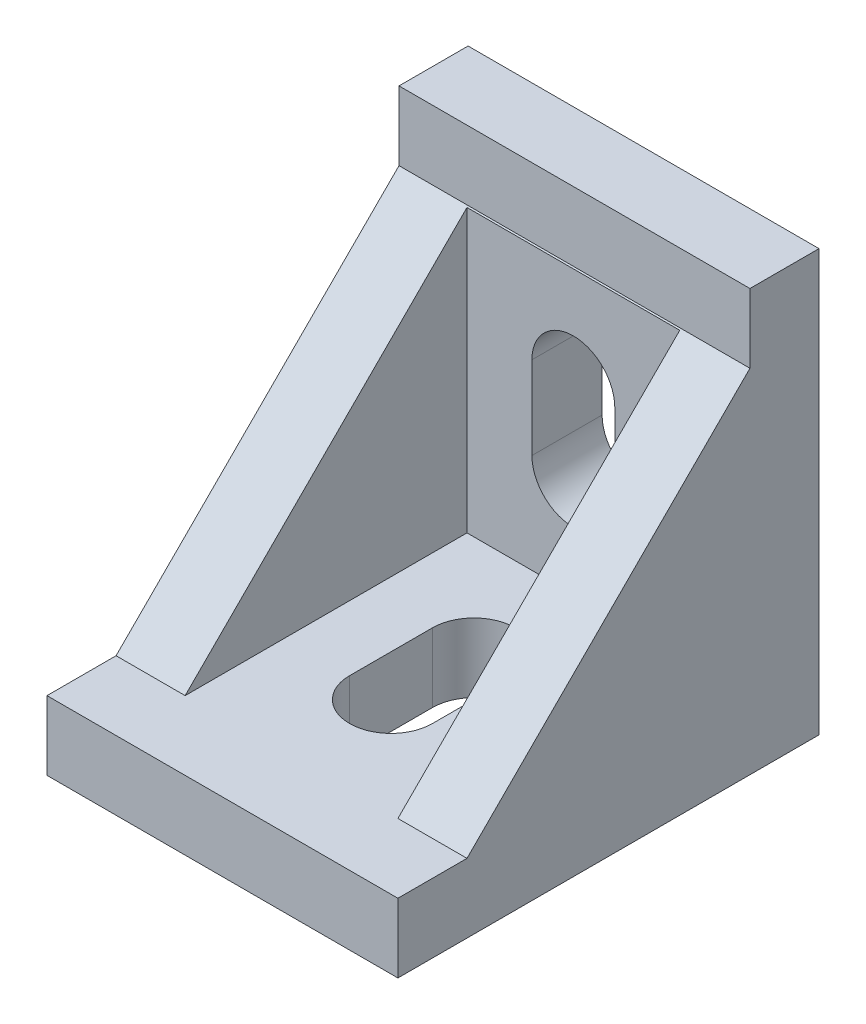
ISO-10303-21;
HEADER;
FILE_DESCRIPTION(('STEP AP214'),'2;1');
FILE_NAME('part.step','',(''),(''),'','','');
FILE_SCHEMA(('AUTOMOTIVE_DESIGN { 1 0 10303 214 1 1 1 1 }'));
ENDSEC;
DATA;
#1=APPLICATION_CONTEXT('core data for automotive mechanical design processes');
#2=APPLICATION_PROTOCOL_DEFINITION('international standard','automotive_design',2000,#1);
#3=PRODUCT_CONTEXT('',#1,'mechanical');
#4=PRODUCT('Part','Part','',(#3));
#5=PRODUCT_RELATED_PRODUCT_CATEGORY('part','',(#4));
#6=PRODUCT_DEFINITION_FORMATION('','',#4);
#7=PRODUCT_DEFINITION_CONTEXT('part definition',#1,'design');
#8=PRODUCT_DEFINITION('design','',#6,#7);
#9=PRODUCT_DEFINITION_SHAPE('','',#8);
#10=(LENGTH_UNIT() NAMED_UNIT(*) SI_UNIT(.MILLI.,.METRE.));
#11=(NAMED_UNIT(*) PLANE_ANGLE_UNIT() SI_UNIT($,.RADIAN.));
#12=(NAMED_UNIT(*) SI_UNIT($,.STERADIAN.) SOLID_ANGLE_UNIT());
#13=UNCERTAINTY_MEASURE_WITH_UNIT(LENGTH_MEASURE(1.E-05),#10,'distance_accuracy_value','');
#14=(GEOMETRIC_REPRESENTATION_CONTEXT(3) GLOBAL_UNCERTAINTY_ASSIGNED_CONTEXT((#13)) GLOBAL_UNIT_ASSIGNED_CONTEXT((#10,
#11,#12)) REPRESENTATION_CONTEXT('',''));
#15=CARTESIAN_POINT('',(0.,0.,0.));
#16=DIRECTION('',(0.,0.,1.));
#17=DIRECTION('',(1.,0.,0.));
#18=AXIS2_PLACEMENT_3D('',#15,#16,#17);
#19=CARTESIAN_POINT('',(25.4,5.,0.));
#20=DIRECTION('',(0.,0.,-1.));
#21=DIRECTION('',(0.,1.,0.));
#22=AXIS2_PLACEMENT_3D('',#19,#20,#21);
#23=PLANE('',#22);
#24=DIRECTION('',(0.,-1.,0.));
#25=VECTOR('',#24,1.);
#26=CARTESIAN_POINT('',(0.,5.,0.));
#27=LINE('',#26,#25);
#28=CARTESIAN_POINT('',(0.,5.,0.));
#29=VERTEX_POINT('',#28);
#30=CARTESIAN_POINT('',(0.,0.,0.));
#31=VERTEX_POINT('',#30);
#32=EDGE_CURVE('E231',#29,#31,#27,.T.);
#33=ORIENTED_EDGE('',*,*,#32,.T.);
#34=DIRECTION('',(-1.,0.,0.));
#35=VECTOR('',#34,1.);
#36=CARTESIAN_POINT('',(25.4,0.,0.));
#37=LINE('',#36,#35);
#38=CARTESIAN_POINT('',(25.4,0.,0.));
#39=VERTEX_POINT('',#38);
#40=EDGE_CURVE('E281',#39,#31,#37,.T.);
#41=ORIENTED_EDGE('',*,*,#40,.F.);
#42=DIRECTION('',(0.,-1.,0.));
#43=VECTOR('',#42,1.);
#44=CARTESIAN_POINT('',(25.4,5.,0.));
#45=LINE('',#44,#43);
#46=CARTESIAN_POINT('',(25.4,5.,0.));
#47=VERTEX_POINT('',#46);
#48=EDGE_CURVE('E232',#47,#39,#45,.T.);
#49=ORIENTED_EDGE('',*,*,#48,.F.);
#50=DIRECTION('',(-1.,0.,0.));
#51=VECTOR('',#50,1.);
#52=CARTESIAN_POINT('',(25.4,5.,0.));
#53=LINE('',#52,#51);
#54=EDGE_CURVE('E248',#47,#29,#53,.T.);
#55=ORIENTED_EDGE('',*,*,#54,.T.);
#56=EDGE_LOOP('',(#33,#41,#49,#55));
#57=FACE_BOUND('',#56,.T.);
#58=ADVANCED_FACE('F39',(#57),#23,.F.);
#59=CARTESIAN_POINT('',(25.4,0.,0.));
#60=DIRECTION('',(0.,1.,0.));
#61=DIRECTION('',(0.,0.,1.));
#62=AXIS2_PLACEMENT_3D('',#59,#60,#61);
#63=PLANE('',#62);
#64=DIRECTION('',(0.,0.,-1.));
#65=VECTOR('',#64,1.);
#66=CARTESIAN_POINT('',(15.7,0.,-18.2));
#67=LINE('',#66,#65);
#68=CARTESIAN_POINT('',(15.7,0.,-12.2));
#69=VERTEX_POINT('',#68);
#70=CARTESIAN_POINT('',(15.7,0.,-18.2));
#71=VERTEX_POINT('',#70);
#72=EDGE_CURVE('E170',#69,#71,#67,.T.);
#73=ORIENTED_EDGE('',*,*,#72,.T.);
#74=CARTESIAN_POINT('',(12.7,0.,-18.2));
#75=DIRECTION('',(0.,1.,0.));
#76=DIRECTION('',(0.,0.,1.));
#77=AXIS2_PLACEMENT_3D('',#74,#75,#76);
#78=CIRCLE('',#77,2.99999999999999);
#79=CARTESIAN_POINT('',(9.70000000000001,0.,-18.2));
#80=VERTEX_POINT('',#79);
#81=EDGE_CURVE('E166',#71,#80,#78,.T.);
#82=ORIENTED_EDGE('',*,*,#81,.T.);
#83=DIRECTION('',(0.,0.,1.));
#84=VECTOR('',#83,1.);
#85=CARTESIAN_POINT('',(9.70000000000001,0.,-18.2));
#86=LINE('',#85,#84);
#87=CARTESIAN_POINT('',(9.70000000000001,0.,-12.2));
#88=VERTEX_POINT('',#87);
#89=EDGE_CURVE('E173',#80,#88,#86,.T.);
#90=ORIENTED_EDGE('',*,*,#89,.T.);
#91=CARTESIAN_POINT('',(12.7,0.,-12.2));
#92=DIRECTION('',(0.,1.,0.));
#93=DIRECTION('',(0.,0.,1.));
#94=AXIS2_PLACEMENT_3D('',#91,#92,#93);
#95=CIRCLE('',#94,2.99999999999999);
#96=EDGE_CURVE('E53',#88,#69,#95,.T.);
#97=ORIENTED_EDGE('',*,*,#96,.T.);
#98=EDGE_LOOP('',(#73,#82,#90,#97));
#99=FACE_BOUND('',#98,.T.);
#100=DIRECTION('',(0.,0.,-1.));
#101=VECTOR('',#100,1.);
#102=CARTESIAN_POINT('',(0.,0.,0.));
#103=LINE('',#102,#101);
#104=CARTESIAN_POINT('',(0.,0.,-30.48));
#105=VERTEX_POINT('',#104);
#106=EDGE_CURVE('E251',#31,#105,#103,.T.);
#107=ORIENTED_EDGE('',*,*,#106,.T.);
#108=DIRECTION('',(-1.,0.,0.));
#109=VECTOR('',#108,1.);
#110=CARTESIAN_POINT('',(25.4,0.,-30.48));
#111=LINE('',#110,#109);
#112=CARTESIAN_POINT('',(25.4,0.,-30.48));
#113=VERTEX_POINT('',#112);
#114=EDGE_CURVE('E278',#113,#105,#111,.T.);
#115=ORIENTED_EDGE('',*,*,#114,.F.);
#116=DIRECTION('',(0.,0.,-1.));
#117=VECTOR('',#116,1.);
#118=CARTESIAN_POINT('',(25.4,0.,0.));
#119=LINE('',#118,#117);
#120=EDGE_CURVE('E235',#39,#113,#119,.T.);
#121=ORIENTED_EDGE('',*,*,#120,.F.);
#122=ORIENTED_EDGE('',*,*,#40,.T.);
#123=EDGE_LOOP('',(#107,#115,#121,#122));
#124=FACE_BOUND('',#123,.T.);
#125=ADVANCED_FACE('F177',(#99,#124),#63,.F.);
#126=CARTESIAN_POINT('',(25.4,0.,-30.48));
#127=DIRECTION('',(0.,0.,1.));
#128=DIRECTION('',(1.,0.,0.));
#129=AXIS2_PLACEMENT_3D('',#126,#127,#128);
#130=PLANE('',#129);
#131=DIRECTION('',(0.,1.,0.));
#132=VECTOR('',#131,1.);
#133=CARTESIAN_POINT('',(15.7,18.2,-30.48));
#134=LINE('',#133,#132);
#135=CARTESIAN_POINT('',(15.7,12.2,-30.48));
#136=VERTEX_POINT('',#135);
#137=CARTESIAN_POINT('',(15.7,18.2,-30.48));
#138=VERTEX_POINT('',#137);
#139=EDGE_CURVE('E199',#136,#138,#134,.T.);
#140=ORIENTED_EDGE('',*,*,#139,.T.);
#141=CARTESIAN_POINT('',(12.7,18.2,-30.48));
#142=DIRECTION('',(0.,0.,1.));
#143=DIRECTION('',(1.,0.,0.));
#144=AXIS2_PLACEMENT_3D('',#141,#142,#143);
#145=CIRCLE('',#144,3.);
#146=CARTESIAN_POINT('',(9.7,18.2,-30.48));
#147=VERTEX_POINT('',#146);
#148=EDGE_CURVE('E186',#138,#147,#145,.T.);
#149=ORIENTED_EDGE('',*,*,#148,.T.);
#150=DIRECTION('',(0.,-1.,0.));
#151=VECTOR('',#150,1.);
#152=CARTESIAN_POINT('',(9.7,18.2,-30.48));
#153=LINE('',#152,#151);
#154=CARTESIAN_POINT('',(9.7,12.2,-30.48));
#155=VERTEX_POINT('',#154);
#156=EDGE_CURVE('E193',#147,#155,#153,.T.);
#157=ORIENTED_EDGE('',*,*,#156,.T.);
#158=CARTESIAN_POINT('',(12.7,12.2,-30.48));
#159=DIRECTION('',(0.,0.,1.));
#160=DIRECTION('',(1.,0.,0.));
#161=AXIS2_PLACEMENT_3D('',#158,#159,#160);
#162=CIRCLE('',#161,3.);
#163=EDGE_CURVE('E196',#155,#136,#162,.T.);
#164=ORIENTED_EDGE('',*,*,#163,.T.);
#165=EDGE_LOOP('',(#140,#149,#157,#164));
#166=FACE_BOUND('',#165,.T.);
#167=DIRECTION('',(0.,1.,0.));
#168=VECTOR('',#167,1.);
#169=CARTESIAN_POINT('',(0.,0.,-30.48));
#170=LINE('',#169,#168);
#171=CARTESIAN_POINT('',(0.,30.48,-30.48));
#172=VERTEX_POINT('',#171);
#173=EDGE_CURVE('E253',#105,#172,#170,.T.);
#174=ORIENTED_EDGE('',*,*,#173,.T.);
#175=DIRECTION('',(-1.,0.,0.));
#176=VECTOR('',#175,1.);
#177=CARTESIAN_POINT('',(25.4,30.48,-30.48));
#178=LINE('',#177,#176);
#179=CARTESIAN_POINT('',(25.4,30.48,-30.48));
#180=VERTEX_POINT('',#179);
#181=EDGE_CURVE('E275',#180,#172,#178,.T.);
#182=ORIENTED_EDGE('',*,*,#181,.F.);
#183=DIRECTION('',(0.,1.,0.));
#184=VECTOR('',#183,1.);
#185=CARTESIAN_POINT('',(25.4,0.,-30.48));
#186=LINE('',#185,#184);
#187=EDGE_CURVE('E238',#113,#180,#186,.T.);
#188=ORIENTED_EDGE('',*,*,#187,.F.);
#189=ORIENTED_EDGE('',*,*,#114,.T.);
#190=EDGE_LOOP('',(#174,#182,#188,#189));
#191=FACE_BOUND('',#190,.T.);
#192=ADVANCED_FACE('F321',(#166,#191),#130,.F.);
#193=CARTESIAN_POINT('',(25.4,30.48,-30.48));
#194=DIRECTION('',(0.,-1.,0.));
#195=DIRECTION('',(0.,0.,-1.));
#196=AXIS2_PLACEMENT_3D('',#193,#194,#195);
#197=PLANE('',#196);
#198=DIRECTION('',(0.,0.,1.));
#199=VECTOR('',#198,1.);
#200=CARTESIAN_POINT('',(0.,30.48,-30.48));
#201=LINE('',#200,#199);
#202=CARTESIAN_POINT('',(0.,30.48,-25.48));
#203=VERTEX_POINT('',#202);
#204=EDGE_CURVE('E255',#172,#203,#201,.T.);
#205=ORIENTED_EDGE('',*,*,#204,.T.);
#206=DIRECTION('',(-1.,0.,0.));
#207=VECTOR('',#206,1.);
#208=CARTESIAN_POINT('',(25.4,30.48,-25.48));
#209=LINE('',#208,#207);
#210=CARTESIAN_POINT('',(25.4,30.48,-25.48));
#211=VERTEX_POINT('',#210);
#212=EDGE_CURVE('E272',#211,#203,#209,.T.);
#213=ORIENTED_EDGE('',*,*,#212,.F.);
#214=DIRECTION('',(0.,0.,1.));
#215=VECTOR('',#214,1.);
#216=CARTESIAN_POINT('',(25.4,30.48,-30.48));
#217=LINE('',#216,#215);
#218=EDGE_CURVE('E240',#180,#211,#217,.T.);
#219=ORIENTED_EDGE('',*,*,#218,.F.);
#220=ORIENTED_EDGE('',*,*,#181,.T.);
#221=EDGE_LOOP('',(#205,#213,#219,#220));
#222=FACE_BOUND('',#221,.T.);
#223=ADVANCED_FACE('F352',(#222),#197,.F.);
#224=CARTESIAN_POINT('',(25.4,30.48,-25.48));
#225=DIRECTION('',(0.,0.,-1.));
#226=DIRECTION('',(-1.,0.,0.));
#227=AXIS2_PLACEMENT_3D('',#224,#225,#226);
#228=PLANE('',#227);
#229=DIRECTION('',(0.,-1.,0.));
#230=VECTOR('',#229,1.);
#231=CARTESIAN_POINT('',(0.,30.48,-25.48));
#232=LINE('',#231,#230);
#233=CARTESIAN_POINT('',(0.,25.48,-25.48));
#234=VERTEX_POINT('',#233);
#235=EDGE_CURVE('E257',#203,#234,#232,.T.);
#236=ORIENTED_EDGE('',*,*,#235,.T.);
#237=DIRECTION('',(-1.,0.,0.));
#238=VECTOR('',#237,1.);
#239=CARTESIAN_POINT('',(25.4,25.48,-25.48));
#240=LINE('',#239,#238);
#241=CARTESIAN_POINT('',(25.4,25.48,-25.48));
#242=VERTEX_POINT('',#241);
#243=EDGE_CURVE('E269',#242,#234,#240,.T.);
#244=ORIENTED_EDGE('',*,*,#243,.F.);
#245=DIRECTION('',(0.,-1.,0.));
#246=VECTOR('',#245,1.);
#247=CARTESIAN_POINT('',(25.4,30.48,-25.48));
#248=LINE('',#247,#246);
#249=EDGE_CURVE('E242',#211,#242,#248,.T.);
#250=ORIENTED_EDGE('',*,*,#249,.F.);
#251=ORIENTED_EDGE('',*,*,#212,.T.);
#252=EDGE_LOOP('',(#236,#244,#250,#251));
#253=FACE_BOUND('',#252,.T.);
#254=ADVANCED_FACE('F347',(#253),#228,.F.);
#255=CARTESIAN_POINT('',(25.4,25.48,-25.48));
#256=DIRECTION('',(0.,-0.707106781186548,-0.707106781186548));
#257=DIRECTION('',(0.,0.707106781186548,-0.707106781186548));
#258=AXIS2_PLACEMENT_3D('',#255,#256,#257);
#259=PLANE('',#258);
#260=DIRECTION('',(-1.,0.,0.));
#261=VECTOR('',#260,1.);
#262=CARTESIAN_POINT('',(25.4,5.,-5.));
#263=LINE('',#262,#261);
#264=CARTESIAN_POINT('',(5.,5.,-5.));
#265=VERTEX_POINT('',#264);
#266=CARTESIAN_POINT('',(0.,5.,-5.));
#267=VERTEX_POINT('',#266);
#268=EDGE_CURVE('E265',#265,#267,#263,.T.);
#269=ORIENTED_EDGE('',*,*,#268,.F.);
#270=DIRECTION('',(0.,0.707106781186548,-0.707106781186548));
#271=VECTOR('',#270,1.);
#272=CARTESIAN_POINT('',(5.,25.48,-25.48));
#273=LINE('',#272,#271);
#274=CARTESIAN_POINT('',(5.,25.4,-25.4));
#275=VERTEX_POINT('',#274);
#276=EDGE_CURVE('E228',#265,#275,#273,.T.);
#277=ORIENTED_EDGE('',*,*,#276,.T.);
#278=DIRECTION('',(-1.,0.,0.));
#279=VECTOR('',#278,1.);
#280=CARTESIAN_POINT('',(25.4,25.4,-25.4));
#281=LINE('',#280,#279);
#282=CARTESIAN_POINT('',(20.4,25.4,-25.4));
#283=VERTEX_POINT('',#282);
#284=EDGE_CURVE('E284',#283,#275,#281,.T.);
#285=ORIENTED_EDGE('',*,*,#284,.F.);
#286=DIRECTION('',(0.,-0.707106781186548,0.707106781186548));
#287=VECTOR('',#286,1.);
#288=CARTESIAN_POINT('',(20.4,25.48,-25.48));
#289=LINE('',#288,#287);
#290=CARTESIAN_POINT('',(20.4,5.,-5.));
#291=VERTEX_POINT('',#290);
#292=EDGE_CURVE('E223',#283,#291,#289,.T.);
#293=ORIENTED_EDGE('',*,*,#292,.T.);
#294=CARTESIAN_POINT('',(25.4,5.,-5.));
#295=VERTEX_POINT('',#294);
#296=EDGE_CURVE('E266',#295,#291,#263,.T.);
#297=ORIENTED_EDGE('',*,*,#296,.F.);
#298=DIRECTION('',(0.,-0.707106781186547,0.707106781186547));
#299=VECTOR('',#298,1.);
#300=CARTESIAN_POINT('',(25.4,25.48,-25.48));
#301=LINE('',#300,#299);
#302=EDGE_CURVE('E244',#242,#295,#301,.T.);
#303=ORIENTED_EDGE('',*,*,#302,.F.);
#304=ORIENTED_EDGE('',*,*,#243,.T.);
#305=DIRECTION('',(0.,-0.707106781186547,0.707106781186547));
#306=VECTOR('',#305,1.);
#307=CARTESIAN_POINT('',(0.,25.48,-25.48));
#308=LINE('',#307,#306);
#309=EDGE_CURVE('E259',#234,#267,#308,.T.);
#310=ORIENTED_EDGE('',*,*,#309,.T.);
#311=EDGE_LOOP('',(#269,#277,#285,#293,#297,#303,#304,#310));
#312=FACE_BOUND('',#311,.T.);
#313=ADVANCED_FACE('F343',(#312),#259,.F.);
#314=CARTESIAN_POINT('',(25.4,5.,-5.));
#315=DIRECTION('',(0.,-1.,0.));
#316=DIRECTION('',(0.,0.,-1.));
#317=AXIS2_PLACEMENT_3D('',#314,#315,#316);
#318=PLANE('',#317);
#319=DIRECTION('',(0.,0.,-1.));
#320=VECTOR('',#319,1.);
#321=CARTESIAN_POINT('',(9.70000000000001,5.,-5.));
#322=LINE('',#321,#320);
#323=CARTESIAN_POINT('',(9.70000000000001,5.,-12.2));
#324=VERTEX_POINT('',#323);
#325=CARTESIAN_POINT('',(9.70000000000001,5.,-18.2));
#326=VERTEX_POINT('',#325);
#327=EDGE_CURVE('E295',#324,#326,#322,.T.);
#328=ORIENTED_EDGE('',*,*,#327,.T.);
#329=CARTESIAN_POINT('',(12.7,5.,-18.2));
#330=DIRECTION('',(0.,-1.,0.));
#331=DIRECTION('',(0.,0.,-1.));
#332=AXIS2_PLACEMENT_3D('',#329,#330,#331);
#333=CIRCLE('',#332,2.99999999999999);
#334=CARTESIAN_POINT('',(15.7,5.,-18.2));
#335=VERTEX_POINT('',#334);
#336=EDGE_CURVE('E11',#326,#335,#333,.T.);
#337=ORIENTED_EDGE('',*,*,#336,.T.);
#338=DIRECTION('',(0.,0.,1.));
#339=VECTOR('',#338,1.);
#340=CARTESIAN_POINT('',(15.7,5.,-5.));
#341=LINE('',#340,#339);
#342=CARTESIAN_POINT('',(15.7,5.,-12.2));
#343=VERTEX_POINT('',#342);
#344=EDGE_CURVE('E46',#335,#343,#341,.T.);
#345=ORIENTED_EDGE('',*,*,#344,.T.);
#346=CARTESIAN_POINT('',(12.7,5.,-12.2));
#347=DIRECTION('',(0.,-1.,0.));
#348=DIRECTION('',(0.,0.,-1.));
#349=AXIS2_PLACEMENT_3D('',#346,#347,#348);
#350=CIRCLE('',#349,2.99999999999999);
#351=EDGE_CURVE('E297',#343,#324,#350,.T.);
#352=ORIENTED_EDGE('',*,*,#351,.T.);
#353=EDGE_LOOP('',(#328,#337,#345,#352));
#354=FACE_BOUND('',#353,.T.);
#355=ORIENTED_EDGE('',*,*,#296,.T.);
#356=DIRECTION('',(0.,0.,1.));
#357=VECTOR('',#356,1.);
#358=CARTESIAN_POINT('',(20.4,5.,-25.4));
#359=LINE('',#358,#357);
#360=CARTESIAN_POINT('',(20.4,5.,-25.4));
#361=VERTEX_POINT('',#360);
#362=EDGE_CURVE('E221',#361,#291,#359,.T.);
#363=ORIENTED_EDGE('',*,*,#362,.F.);
#364=DIRECTION('',(1.,0.,0.));
#365=VECTOR('',#364,1.);
#366=CARTESIAN_POINT('',(5.,5.,-25.4));
#367=LINE('',#366,#365);
#368=CARTESIAN_POINT('',(5.,5.,-25.4));
#369=VERTEX_POINT('',#368);
#370=EDGE_CURVE('E215',#369,#361,#367,.T.);
#371=ORIENTED_EDGE('',*,*,#370,.F.);
#372=DIRECTION('',(0.,0.,1.));
#373=VECTOR('',#372,1.);
#374=CARTESIAN_POINT('',(5.,5.,-25.4));
#375=LINE('',#374,#373);
#376=EDGE_CURVE('E220',#369,#265,#375,.T.);
#377=ORIENTED_EDGE('',*,*,#376,.T.);
#378=ORIENTED_EDGE('',*,*,#268,.T.);
#379=DIRECTION('',(0.,0.,1.));
#380=VECTOR('',#379,1.);
#381=CARTESIAN_POINT('',(0.,5.,-5.));
#382=LINE('',#381,#380);
#383=EDGE_CURVE('E236',#267,#29,#382,.T.);
#384=ORIENTED_EDGE('',*,*,#383,.T.);
#385=ORIENTED_EDGE('',*,*,#54,.F.);
#386=DIRECTION('',(0.,0.,1.));
#387=VECTOR('',#386,1.);
#388=CARTESIAN_POINT('',(25.4,5.,-5.));
#389=LINE('',#388,#387);
#390=EDGE_CURVE('E246',#295,#47,#389,.T.);
#391=ORIENTED_EDGE('',*,*,#390,.F.);
#392=EDGE_LOOP('',(#355,#363,#371,#377,#378,#384,#385,#391));
#393=FACE_BOUND('',#392,.T.);
#394=ADVANCED_FACE('F301',(#354,#393),#318,.F.);
#395=CARTESIAN_POINT('',(25.4,0.,0.));
#396=DIRECTION('',(1.,0.,0.));
#397=DIRECTION('',(0.,0.,-1.));
#398=AXIS2_PLACEMENT_3D('',#395,#396,#397);
#399=PLANE('',#398);
#400=ORIENTED_EDGE('',*,*,#48,.T.);
#401=ORIENTED_EDGE('',*,*,#120,.T.);
#402=ORIENTED_EDGE('',*,*,#187,.T.);
#403=ORIENTED_EDGE('',*,*,#218,.T.);
#404=ORIENTED_EDGE('',*,*,#249,.T.);
#405=ORIENTED_EDGE('',*,*,#302,.T.);
#406=ORIENTED_EDGE('',*,*,#390,.T.);
#407=EDGE_LOOP('',(#400,#401,#402,#403,#404,#405,#406));
#408=FACE_BOUND('',#407,.T.);
#409=ADVANCED_FACE('F335',(#408),#399,.T.);
#410=CARTESIAN_POINT('',(0.,0.,0.));
#411=DIRECTION('',(1.,0.,0.));
#412=DIRECTION('',(0.,0.,-1.));
#413=AXIS2_PLACEMENT_3D('',#410,#411,#412);
#414=PLANE('',#413);
#415=ORIENTED_EDGE('',*,*,#32,.F.);
#416=ORIENTED_EDGE('',*,*,#383,.F.);
#417=ORIENTED_EDGE('',*,*,#309,.F.);
#418=ORIENTED_EDGE('',*,*,#235,.F.);
#419=ORIENTED_EDGE('',*,*,#204,.F.);
#420=ORIENTED_EDGE('',*,*,#173,.F.);
#421=ORIENTED_EDGE('',*,*,#106,.F.);
#422=EDGE_LOOP('',(#415,#416,#417,#418,#419,#420,#421));
#423=FACE_BOUND('',#422,.T.);
#424=ADVANCED_FACE('F328',(#423),#414,.F.);
#425=CARTESIAN_POINT('',(0.,0.,-25.4));
#426=DIRECTION('',(0.,0.,1.));
#427=DIRECTION('',(1.,0.,0.));
#428=AXIS2_PLACEMENT_3D('',#425,#426,#427);
#429=PLANE('',#428);
#430=CARTESIAN_POINT('',(12.7,18.2,-25.4));
#431=DIRECTION('',(0.,0.,1.));
#432=DIRECTION('',(1.,0.,0.));
#433=AXIS2_PLACEMENT_3D('',#430,#431,#432);
#434=CIRCLE('',#433,3.);
#435=CARTESIAN_POINT('',(15.7,18.2,-25.4));
#436=VERTEX_POINT('',#435);
#437=CARTESIAN_POINT('',(9.7,18.2,-25.4));
#438=VERTEX_POINT('',#437);
#439=EDGE_CURVE('E292',#436,#438,#434,.T.);
#440=ORIENTED_EDGE('',*,*,#439,.F.);
#441=DIRECTION('',(0.,1.,0.));
#442=VECTOR('',#441,1.);
#443=CARTESIAN_POINT('',(15.7,0.,-25.4));
#444=LINE('',#443,#442);
#445=CARTESIAN_POINT('',(15.7,12.2,-25.4));
#446=VERTEX_POINT('',#445);
#447=EDGE_CURVE('E290',#446,#436,#444,.T.);
#448=ORIENTED_EDGE('',*,*,#447,.F.);
#449=CARTESIAN_POINT('',(12.7,12.2,-25.4));
#450=DIRECTION('',(0.,0.,1.));
#451=DIRECTION('',(1.,0.,0.));
#452=AXIS2_PLACEMENT_3D('',#449,#450,#451);
#453=CIRCLE('',#452,3.);
#454=CARTESIAN_POINT('',(9.7,12.2,-25.4));
#455=VERTEX_POINT('',#454);
#456=EDGE_CURVE('E288',#455,#446,#453,.T.);
#457=ORIENTED_EDGE('',*,*,#456,.F.);
#458=DIRECTION('',(0.,-1.,0.));
#459=VECTOR('',#458,1.);
#460=CARTESIAN_POINT('',(9.70000000000001,0.,-25.4));
#461=LINE('',#460,#459);
#462=EDGE_CURVE('E286',#438,#455,#461,.T.);
#463=ORIENTED_EDGE('',*,*,#462,.F.);
#464=EDGE_LOOP('',(#440,#448,#457,#463));
#465=FACE_BOUND('',#464,.T.);
#466=ORIENTED_EDGE('',*,*,#284,.T.);
#467=DIRECTION('',(0.,-1.,0.));
#468=VECTOR('',#467,1.);
#469=CARTESIAN_POINT('',(5.,25.48,-25.4));
#470=LINE('',#469,#468);
#471=EDGE_CURVE('E206',#275,#369,#470,.T.);
#472=ORIENTED_EDGE('',*,*,#471,.T.);
#473=ORIENTED_EDGE('',*,*,#370,.T.);
#474=DIRECTION('',(0.,1.,0.));
#475=VECTOR('',#474,1.);
#476=CARTESIAN_POINT('',(20.4,25.48,-25.4));
#477=LINE('',#476,#475);
#478=EDGE_CURVE('E218',#361,#283,#477,.T.);
#479=ORIENTED_EDGE('',*,*,#478,.T.);
#480=EDGE_LOOP('',(#466,#472,#473,#479));
#481=FACE_BOUND('',#480,.T.);
#482=ADVANCED_FACE('F371',(#465,#481),#429,.T.);
#483=CARTESIAN_POINT('',(5.,25.48,-25.4));
#484=DIRECTION('',(-1.,0.,0.));
#485=DIRECTION('',(0.,-1.,0.));
#486=AXIS2_PLACEMENT_3D('',#483,#484,#485);
#487=PLANE('',#486);
#488=ORIENTED_EDGE('',*,*,#376,.F.);
#489=ORIENTED_EDGE('',*,*,#471,.F.);
#490=ORIENTED_EDGE('',*,*,#276,.F.);
#491=EDGE_LOOP('',(#488,#489,#490));
#492=FACE_BOUND('',#491,.T.);
#493=ADVANCED_FACE('F374',(#492),#487,.F.);
#494=CARTESIAN_POINT('',(20.4,25.48,-25.4));
#495=DIRECTION('',(1.,0.,0.));
#496=DIRECTION('',(0.,1.,0.));
#497=AXIS2_PLACEMENT_3D('',#494,#495,#496);
#498=PLANE('',#497);
#499=ORIENTED_EDGE('',*,*,#478,.F.);
#500=ORIENTED_EDGE('',*,*,#362,.T.);
#501=ORIENTED_EDGE('',*,*,#292,.F.);
#502=EDGE_LOOP('',(#499,#500,#501));
#503=FACE_BOUND('',#502,.T.);
#504=ADVANCED_FACE('F377',(#503),#498,.F.);
#505=CARTESIAN_POINT('',(12.7,18.2,-30.48));
#506=DIRECTION('',(0.,0.,1.));
#507=DIRECTION('',(1.,0.,0.));
#508=AXIS2_PLACEMENT_3D('',#505,#506,#507);
#509=CYLINDRICAL_SURFACE('',#508,3.);
#510=ORIENTED_EDGE('',*,*,#439,.T.);
#511=DIRECTION('',(0.,0.,1.));
#512=VECTOR('',#511,1.);
#513=CARTESIAN_POINT('',(9.7,18.2,-30.48));
#514=LINE('',#513,#512);
#515=EDGE_CURVE('E202',#147,#438,#514,.T.);
#516=ORIENTED_EDGE('',*,*,#515,.F.);
#517=ORIENTED_EDGE('',*,*,#148,.F.);
#518=DIRECTION('',(0.,0.,1.));
#519=VECTOR('',#518,1.);
#520=CARTESIAN_POINT('',(15.7,18.2,-30.48));
#521=LINE('',#520,#519);
#522=EDGE_CURVE('E203',#138,#436,#521,.T.);
#523=ORIENTED_EDGE('',*,*,#522,.T.);
#524=EDGE_LOOP('',(#510,#516,#517,#523));
#525=FACE_BOUND('',#524,.T.);
#526=ADVANCED_FACE('F380',(#525),#509,.F.);
#527=CARTESIAN_POINT('',(15.7,18.2,-30.48));
#528=DIRECTION('',(1.,0.,0.));
#529=DIRECTION('',(0.,1.,0.));
#530=AXIS2_PLACEMENT_3D('',#527,#528,#529);
#531=PLANE('',#530);
#532=ORIENTED_EDGE('',*,*,#447,.T.);
#533=ORIENTED_EDGE('',*,*,#522,.F.);
#534=ORIENTED_EDGE('',*,*,#139,.F.);
#535=DIRECTION('',(0.,0.,1.));
#536=VECTOR('',#535,1.);
#537=CARTESIAN_POINT('',(15.7,12.2,-30.48));
#538=LINE('',#537,#536);
#539=EDGE_CURVE('E207',#136,#446,#538,.T.);
#540=ORIENTED_EDGE('',*,*,#539,.T.);
#541=EDGE_LOOP('',(#532,#533,#534,#540));
#542=FACE_BOUND('',#541,.T.);
#543=ADVANCED_FACE('F386',(#542),#531,.F.);
#544=CARTESIAN_POINT('',(12.7,12.2,-30.48));
#545=DIRECTION('',(0.,0.,1.));
#546=DIRECTION('',(1.,0.,0.));
#547=AXIS2_PLACEMENT_3D('',#544,#545,#546);
#548=CYLINDRICAL_SURFACE('',#547,3.);
#549=ORIENTED_EDGE('',*,*,#456,.T.);
#550=ORIENTED_EDGE('',*,*,#539,.F.);
#551=ORIENTED_EDGE('',*,*,#163,.F.);
#552=DIRECTION('',(0.,0.,1.));
#553=VECTOR('',#552,1.);
#554=CARTESIAN_POINT('',(9.7,12.2,-30.48));
#555=LINE('',#554,#553);
#556=EDGE_CURVE('E210',#155,#455,#555,.T.);
#557=ORIENTED_EDGE('',*,*,#556,.T.);
#558=EDGE_LOOP('',(#549,#550,#551,#557));
#559=FACE_BOUND('',#558,.T.);
#560=ADVANCED_FACE('F391',(#559),#548,.F.);
#561=CARTESIAN_POINT('',(9.7,18.2,-30.48));
#562=DIRECTION('',(-1.,0.,0.));
#563=DIRECTION('',(0.,-1.,0.));
#564=AXIS2_PLACEMENT_3D('',#561,#562,#563);
#565=PLANE('',#564);
#566=ORIENTED_EDGE('',*,*,#462,.T.);
#567=ORIENTED_EDGE('',*,*,#556,.F.);
#568=ORIENTED_EDGE('',*,*,#156,.F.);
#569=ORIENTED_EDGE('',*,*,#515,.T.);
#570=EDGE_LOOP('',(#566,#567,#568,#569));
#571=FACE_BOUND('',#570,.T.);
#572=ADVANCED_FACE('F388',(#571),#565,.F.);
#573=CARTESIAN_POINT('',(12.7,0.,-18.2));
#574=DIRECTION('',(0.,1.,0.));
#575=DIRECTION('',(0.,0.,1.));
#576=AXIS2_PLACEMENT_3D('',#573,#574,#575);
#577=CYLINDRICAL_SURFACE('',#576,2.99999999999999);
#578=DIRECTION('',(0.,1.,0.));
#579=VECTOR('',#578,1.);
#580=CARTESIAN_POINT('',(9.70000000000001,0.,-18.2));
#581=LINE('',#580,#579);
#582=EDGE_CURVE('E61',#80,#326,#581,.T.);
#583=ORIENTED_EDGE('',*,*,#582,.F.);
#584=ORIENTED_EDGE('',*,*,#81,.F.);
#585=DIRECTION('',(0.,1.,0.));
#586=VECTOR('',#585,1.);
#587=CARTESIAN_POINT('',(15.7,0.,-18.2));
#588=LINE('',#587,#586);
#589=EDGE_CURVE('E184',#71,#335,#588,.T.);
#590=ORIENTED_EDGE('',*,*,#589,.T.);
#591=ORIENTED_EDGE('',*,*,#336,.F.);
#592=EDGE_LOOP('',(#583,#584,#590,#591));
#593=FACE_BOUND('',#592,.T.);
#594=ADVANCED_FACE('F163',(#593),#577,.F.);
#595=CARTESIAN_POINT('',(15.7,0.,-18.2));
#596=DIRECTION('',(1.,0.,0.));
#597=DIRECTION('',(0.,0.,-1.));
#598=AXIS2_PLACEMENT_3D('',#595,#596,#597);
#599=PLANE('',#598);
#600=ORIENTED_EDGE('',*,*,#589,.F.);
#601=ORIENTED_EDGE('',*,*,#72,.F.);
#602=DIRECTION('',(0.,1.,0.));
#603=VECTOR('',#602,1.);
#604=CARTESIAN_POINT('',(15.7,0.,-12.2));
#605=LINE('',#604,#603);
#606=EDGE_CURVE('E187',#69,#343,#605,.T.);
#607=ORIENTED_EDGE('',*,*,#606,.T.);
#608=ORIENTED_EDGE('',*,*,#344,.F.);
#609=EDGE_LOOP('',(#600,#601,#607,#608));
#610=FACE_BOUND('',#609,.T.);
#611=ADVANCED_FACE('F304',(#610),#599,.F.);
#612=CARTESIAN_POINT('',(12.7,0.,-12.2));
#613=DIRECTION('',(0.,1.,0.));
#614=DIRECTION('',(0.,0.,1.));
#615=AXIS2_PLACEMENT_3D('',#612,#613,#614);
#616=CYLINDRICAL_SURFACE('',#615,2.99999999999999);
#617=ORIENTED_EDGE('',*,*,#606,.F.);
#618=ORIENTED_EDGE('',*,*,#96,.F.);
#619=DIRECTION('',(0.,1.,0.));
#620=VECTOR('',#619,1.);
#621=CARTESIAN_POINT('',(9.70000000000001,0.,-12.2));
#622=LINE('',#621,#620);
#623=EDGE_CURVE('E169',#88,#324,#622,.T.);
#624=ORIENTED_EDGE('',*,*,#623,.T.);
#625=ORIENTED_EDGE('',*,*,#351,.F.);
#626=EDGE_LOOP('',(#617,#618,#624,#625));
#627=FACE_BOUND('',#626,.T.);
#628=ADVANCED_FACE('F305',(#627),#616,.F.);
#629=CARTESIAN_POINT('',(9.70000000000001,0.,-18.2));
#630=DIRECTION('',(-1.,0.,0.));
#631=DIRECTION('',(0.,0.,1.));
#632=AXIS2_PLACEMENT_3D('',#629,#630,#631);
#633=PLANE('',#632);
#634=ORIENTED_EDGE('',*,*,#623,.F.);
#635=ORIENTED_EDGE('',*,*,#89,.F.);
#636=ORIENTED_EDGE('',*,*,#582,.T.);
#637=ORIENTED_EDGE('',*,*,#327,.F.);
#638=EDGE_LOOP('',(#634,#635,#636,#637));
#639=FACE_BOUND('',#638,.T.);
#640=ADVANCED_FACE('F174',(#639),#633,.F.);
#641=CLOSED_SHELL('',(#58,#125,#192,#223,#254,#313,#394,#409,#424,#482,#493,#504,#526,#543,#560,
#572,#594,#611,#628,#640));
#642=MANIFOLD_SOLID_BREP('B2',#641);
#643=ADVANCED_BREP_SHAPE_REPRESENTATION('',(#18,#642),#14);
#644=SHAPE_DEFINITION_REPRESENTATION(#9,#643);
ENDSEC;
END-ISO-10303-21;
